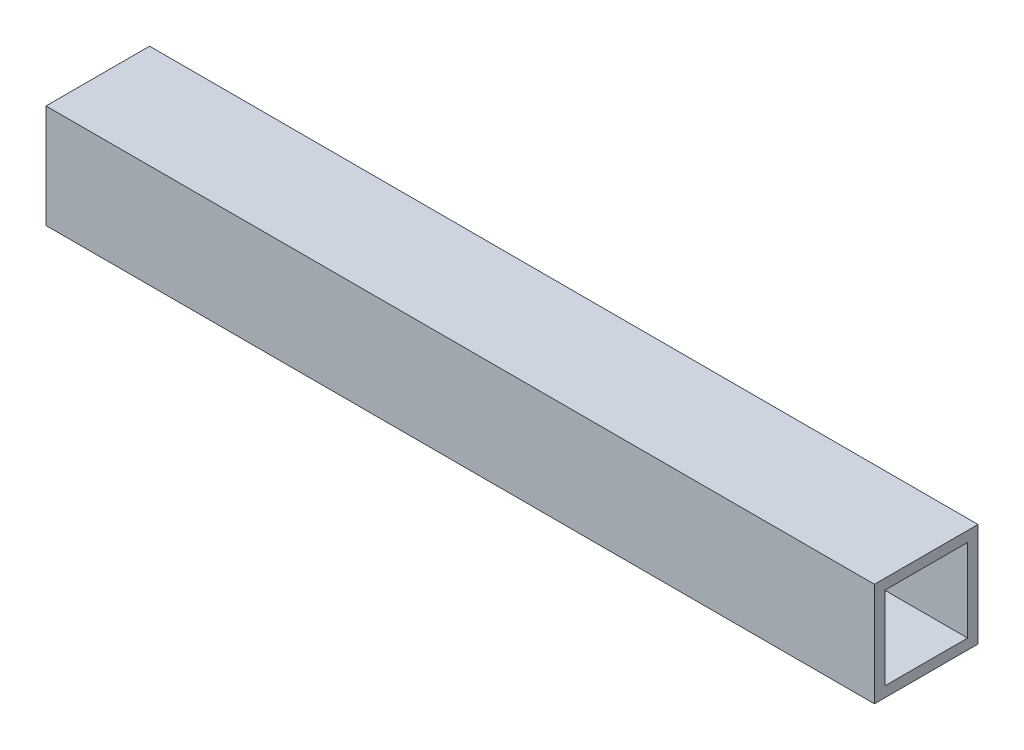
ISO-10303-21;
HEADER;
FILE_DESCRIPTION(('STEP AP214'),'2;1');
FILE_NAME('part.step','',(''),(''),'','','');
FILE_SCHEMA(('AUTOMOTIVE_DESIGN { 1 0 10303 214 1 1 1 1 }'));
ENDSEC;
DATA;
#1=APPLICATION_CONTEXT('core data for automotive mechanical design processes');
#2=APPLICATION_PROTOCOL_DEFINITION('international standard','automotive_design',2000,#1);
#3=PRODUCT_CONTEXT('',#1,'mechanical');
#4=PRODUCT('Part','Part','',(#3));
#5=PRODUCT_RELATED_PRODUCT_CATEGORY('part','',(#4));
#6=PRODUCT_DEFINITION_FORMATION('','',#4);
#7=PRODUCT_DEFINITION_CONTEXT('part definition',#1,'design');
#8=PRODUCT_DEFINITION('design','',#6,#7);
#9=PRODUCT_DEFINITION_SHAPE('','',#8);
#10=(LENGTH_UNIT() NAMED_UNIT(*) SI_UNIT(.MILLI.,.METRE.));
#11=(NAMED_UNIT(*) PLANE_ANGLE_UNIT() SI_UNIT($,.RADIAN.));
#12=(NAMED_UNIT(*) SI_UNIT($,.STERADIAN.) SOLID_ANGLE_UNIT());
#13=UNCERTAINTY_MEASURE_WITH_UNIT(LENGTH_MEASURE(1.E-05),#10,'distance_accuracy_value','');
#14=(GEOMETRIC_REPRESENTATION_CONTEXT(3) GLOBAL_UNCERTAINTY_ASSIGNED_CONTEXT((#13)) GLOBAL_UNIT_ASSIGNED_CONTEXT((#10,
#11,#12)) REPRESENTATION_CONTEXT('',''));
#15=CARTESIAN_POINT('',(0.,0.,0.));
#16=DIRECTION('',(0.,0.,1.));
#17=DIRECTION('',(1.,0.,0.));
#18=AXIS2_PLACEMENT_3D('',#15,#16,#17);
#19=CARTESIAN_POINT('',(203.2,0.,0.));
#20=DIRECTION('',(-1.,0.,0.));
#21=DIRECTION('',(0.,0.,1.));
#22=AXIS2_PLACEMENT_3D('',#19,#20,#21);
#23=PLANE('',#22);
#24=DIRECTION('',(0.,1.,0.));
#25=VECTOR('',#24,1.);
#26=CARTESIAN_POINT('',(203.2,-12.7,-12.7));
#27=LINE('',#26,#25);
#28=CARTESIAN_POINT('',(203.2,-12.7,-12.7));
#29=VERTEX_POINT('',#28);
#30=CARTESIAN_POINT('',(203.2,12.7,-12.7));
#31=VERTEX_POINT('',#30);
#32=EDGE_CURVE('E133',#29,#31,#27,.T.);
#33=ORIENTED_EDGE('',*,*,#32,.T.);
#34=DIRECTION('',(0.,0.,1.));
#35=VECTOR('',#34,1.);
#36=CARTESIAN_POINT('',(203.2,12.7,12.7));
#37=LINE('',#36,#35);
#38=CARTESIAN_POINT('',(203.2,12.7,12.7));
#39=VERTEX_POINT('',#38);
#40=EDGE_CURVE('E136',#31,#39,#37,.T.);
#41=ORIENTED_EDGE('',*,*,#40,.T.);
#42=DIRECTION('',(0.,-1.,0.));
#43=VECTOR('',#42,1.);
#44=CARTESIAN_POINT('',(203.2,-12.7,12.7));
#45=LINE('',#44,#43);
#46=CARTESIAN_POINT('',(203.2,-12.7,12.7));
#47=VERTEX_POINT('',#46);
#48=EDGE_CURVE('E139',#39,#47,#45,.T.);
#49=ORIENTED_EDGE('',*,*,#48,.T.);
#50=DIRECTION('',(0.,0.,-1.));
#51=VECTOR('',#50,1.);
#52=CARTESIAN_POINT('',(203.2,-12.7,12.7));
#53=LINE('',#52,#51);
#54=EDGE_CURVE('E141',#47,#29,#53,.T.);
#55=ORIENTED_EDGE('',*,*,#54,.T.);
#56=EDGE_LOOP('',(#33,#41,#49,#55));
#57=FACE_BOUND('',#56,.T.);
#58=DIRECTION('',(0.,-1.,0.));
#59=VECTOR('',#58,1.);
#60=CARTESIAN_POINT('',(203.2,-10.16,10.16));
#61=LINE('',#60,#59);
#62=CARTESIAN_POINT('',(203.2,10.16,10.16));
#63=VERTEX_POINT('',#62);
#64=CARTESIAN_POINT('',(203.2,-10.16,10.16));
#65=VERTEX_POINT('',#64);
#66=EDGE_CURVE('E97',#63,#65,#61,.T.);
#67=ORIENTED_EDGE('',*,*,#66,.F.);
#68=DIRECTION('',(0.,0.,1.));
#69=VECTOR('',#68,1.);
#70=CARTESIAN_POINT('',(203.2,10.16,10.16));
#71=LINE('',#70,#69);
#72=CARTESIAN_POINT('',(203.2,10.16,-10.16));
#73=VERTEX_POINT('',#72);
#74=EDGE_CURVE('E119',#73,#63,#71,.T.);
#75=ORIENTED_EDGE('',*,*,#74,.F.);
#76=DIRECTION('',(0.,1.,0.));
#77=VECTOR('',#76,1.);
#78=CARTESIAN_POINT('',(203.2,-10.16,-10.16));
#79=LINE('',#78,#77);
#80=CARTESIAN_POINT('',(203.2,-10.16,-10.16));
#81=VERTEX_POINT('',#80);
#82=EDGE_CURVE('E117',#81,#73,#79,.T.);
#83=ORIENTED_EDGE('',*,*,#82,.F.);
#84=DIRECTION('',(0.,0.,-1.));
#85=VECTOR('',#84,1.);
#86=CARTESIAN_POINT('',(203.2,-10.16,10.16));
#87=LINE('',#86,#85);
#88=EDGE_CURVE('E105',#65,#81,#87,.T.);
#89=ORIENTED_EDGE('',*,*,#88,.F.);
#90=EDGE_LOOP('',(#67,#75,#83,#89));
#91=FACE_BOUND('',#90,.T.);
#92=ADVANCED_FACE('F32',(#57,#91),#23,.F.);
#93=CARTESIAN_POINT('',(0.,0.,0.));
#94=DIRECTION('',(-1.,0.,0.));
#95=DIRECTION('',(0.,0.,1.));
#96=AXIS2_PLACEMENT_3D('',#93,#94,#95);
#97=PLANE('',#96);
#98=DIRECTION('',(0.,1.,0.));
#99=VECTOR('',#98,1.);
#100=CARTESIAN_POINT('',(0.,-12.7,-12.7));
#101=LINE('',#100,#99);
#102=CARTESIAN_POINT('',(0.,-12.7,-12.7));
#103=VERTEX_POINT('',#102);
#104=CARTESIAN_POINT('',(0.,12.7,-12.7));
#105=VERTEX_POINT('',#104);
#106=EDGE_CURVE('E113',#103,#105,#101,.T.);
#107=ORIENTED_EDGE('',*,*,#106,.F.);
#108=DIRECTION('',(0.,0.,-1.));
#109=VECTOR('',#108,1.);
#110=CARTESIAN_POINT('',(0.,-12.7,12.7));
#111=LINE('',#110,#109);
#112=CARTESIAN_POINT('',(0.,-12.7,12.7));
#113=VERTEX_POINT('',#112);
#114=EDGE_CURVE('E137',#113,#103,#111,.T.);
#115=ORIENTED_EDGE('',*,*,#114,.F.);
#116=DIRECTION('',(0.,-1.,0.));
#117=VECTOR('',#116,1.);
#118=CARTESIAN_POINT('',(0.,-12.7,12.7));
#119=LINE('',#118,#117);
#120=CARTESIAN_POINT('',(0.,12.7,12.7));
#121=VERTEX_POINT('',#120);
#122=EDGE_CURVE('E148',#121,#113,#119,.T.);
#123=ORIENTED_EDGE('',*,*,#122,.F.);
#124=DIRECTION('',(0.,0.,1.));
#125=VECTOR('',#124,1.);
#126=CARTESIAN_POINT('',(0.,12.7,12.7));
#127=LINE('',#126,#125);
#128=EDGE_CURVE('E146',#105,#121,#127,.T.);
#129=ORIENTED_EDGE('',*,*,#128,.F.);
#130=EDGE_LOOP('',(#107,#115,#123,#129));
#131=FACE_BOUND('',#130,.T.);
#132=DIRECTION('',(0.,0.,1.));
#133=VECTOR('',#132,1.);
#134=CARTESIAN_POINT('',(0.,10.16,10.16));
#135=LINE('',#134,#133);
#136=CARTESIAN_POINT('',(0.,10.16,-10.16));
#137=VERTEX_POINT('',#136);
#138=CARTESIAN_POINT('',(0.,10.16,10.16));
#139=VERTEX_POINT('',#138);
#140=EDGE_CURVE('E106',#137,#139,#135,.T.);
#141=ORIENTED_EDGE('',*,*,#140,.T.);
#142=DIRECTION('',(0.,-1.,0.));
#143=VECTOR('',#142,1.);
#144=CARTESIAN_POINT('',(0.,-10.16,10.16));
#145=LINE('',#144,#143);
#146=CARTESIAN_POINT('',(0.,-10.16,10.16));
#147=VERTEX_POINT('',#146);
#148=EDGE_CURVE('E55',#139,#147,#145,.T.);
#149=ORIENTED_EDGE('',*,*,#148,.T.);
#150=DIRECTION('',(0.,0.,-1.));
#151=VECTOR('',#150,1.);
#152=CARTESIAN_POINT('',(0.,-10.16,10.16));
#153=LINE('',#152,#151);
#154=CARTESIAN_POINT('',(0.,-10.16,-10.16));
#155=VERTEX_POINT('',#154);
#156=EDGE_CURVE('E112',#147,#155,#153,.T.);
#157=ORIENTED_EDGE('',*,*,#156,.T.);
#158=DIRECTION('',(0.,1.,0.));
#159=VECTOR('',#158,1.);
#160=CARTESIAN_POINT('',(0.,-10.16,-10.16));
#161=LINE('',#160,#159);
#162=EDGE_CURVE('E125',#155,#137,#161,.T.);
#163=ORIENTED_EDGE('',*,*,#162,.T.);
#164=EDGE_LOOP('',(#141,#149,#157,#163));
#165=FACE_BOUND('',#164,.T.);
#166=ADVANCED_FACE('F166',(#131,#165),#97,.T.);
#167=CARTESIAN_POINT('',(203.2,-12.7,-12.7));
#168=DIRECTION('',(0.,0.,1.));
#169=DIRECTION('',(1.,0.,0.));
#170=AXIS2_PLACEMENT_3D('',#167,#168,#169);
#171=PLANE('',#170);
#172=ORIENTED_EDGE('',*,*,#106,.T.);
#173=DIRECTION('',(-1.,0.,0.));
#174=VECTOR('',#173,1.);
#175=CARTESIAN_POINT('',(203.2,12.7,-12.7));
#176=LINE('',#175,#174);
#177=EDGE_CURVE('E11',#31,#105,#176,.T.);
#178=ORIENTED_EDGE('',*,*,#177,.F.);
#179=ORIENTED_EDGE('',*,*,#32,.F.);
#180=DIRECTION('',(-1.,0.,0.));
#181=VECTOR('',#180,1.);
#182=CARTESIAN_POINT('',(203.2,-12.7,-12.7));
#183=LINE('',#182,#181);
#184=EDGE_CURVE('E143',#29,#103,#183,.T.);
#185=ORIENTED_EDGE('',*,*,#184,.T.);
#186=EDGE_LOOP('',(#172,#178,#179,#185));
#187=FACE_BOUND('',#186,.T.);
#188=ADVANCED_FACE('F34',(#187),#171,.F.);
#189=CARTESIAN_POINT('',(203.2,12.7,12.7));
#190=DIRECTION('',(0.,-1.,0.));
#191=DIRECTION('',(0.,0.,-1.));
#192=AXIS2_PLACEMENT_3D('',#189,#190,#191);
#193=PLANE('',#192);
#194=ORIENTED_EDGE('',*,*,#128,.T.);
#195=DIRECTION('',(-1.,0.,0.));
#196=VECTOR('',#195,1.);
#197=CARTESIAN_POINT('',(203.2,12.7,12.7));
#198=LINE('',#197,#196);
#199=EDGE_CURVE('E40',#39,#121,#198,.T.);
#200=ORIENTED_EDGE('',*,*,#199,.F.);
#201=ORIENTED_EDGE('',*,*,#40,.F.);
#202=ORIENTED_EDGE('',*,*,#177,.T.);
#203=EDGE_LOOP('',(#194,#200,#201,#202));
#204=FACE_BOUND('',#203,.T.);
#205=ADVANCED_FACE('F176',(#204),#193,.F.);
#206=CARTESIAN_POINT('',(203.2,-12.7,12.7));
#207=DIRECTION('',(0.,0.,-1.));
#208=DIRECTION('',(-1.,0.,0.));
#209=AXIS2_PLACEMENT_3D('',#206,#207,#208);
#210=PLANE('',#209);
#211=ORIENTED_EDGE('',*,*,#122,.T.);
#212=DIRECTION('',(-1.,0.,0.));
#213=VECTOR('',#212,1.);
#214=CARTESIAN_POINT('',(203.2,-12.7,12.7));
#215=LINE('',#214,#213);
#216=EDGE_CURVE('E153',#47,#113,#215,.T.);
#217=ORIENTED_EDGE('',*,*,#216,.F.);
#218=ORIENTED_EDGE('',*,*,#48,.F.);
#219=ORIENTED_EDGE('',*,*,#199,.T.);
#220=EDGE_LOOP('',(#211,#217,#218,#219));
#221=FACE_BOUND('',#220,.T.);
#222=ADVANCED_FACE('F160',(#221),#210,.F.);
#223=CARTESIAN_POINT('',(203.2,-12.7,12.7));
#224=DIRECTION('',(0.,1.,0.));
#225=DIRECTION('',(0.,0.,1.));
#226=AXIS2_PLACEMENT_3D('',#223,#224,#225);
#227=PLANE('',#226);
#228=ORIENTED_EDGE('',*,*,#114,.T.);
#229=ORIENTED_EDGE('',*,*,#184,.F.);
#230=ORIENTED_EDGE('',*,*,#54,.F.);
#231=ORIENTED_EDGE('',*,*,#216,.T.);
#232=EDGE_LOOP('',(#228,#229,#230,#231));
#233=FACE_BOUND('',#232,.T.);
#234=ADVANCED_FACE('F170',(#233),#227,.F.);
#235=CARTESIAN_POINT('',(203.2,-10.16,10.16));
#236=DIRECTION('',(0.,0.,-1.));
#237=DIRECTION('',(-1.,0.,0.));
#238=AXIS2_PLACEMENT_3D('',#235,#236,#237);
#239=PLANE('',#238);
#240=ORIENTED_EDGE('',*,*,#148,.F.);
#241=DIRECTION('',(-1.,0.,0.));
#242=VECTOR('',#241,1.);
#243=CARTESIAN_POINT('',(203.2,10.16,10.16));
#244=LINE('',#243,#242);
#245=EDGE_CURVE('E101',#63,#139,#244,.T.);
#246=ORIENTED_EDGE('',*,*,#245,.F.);
#247=ORIENTED_EDGE('',*,*,#66,.T.);
#248=DIRECTION('',(-1.,0.,0.));
#249=VECTOR('',#248,1.);
#250=CARTESIAN_POINT('',(203.2,-10.16,10.16));
#251=LINE('',#250,#249);
#252=EDGE_CURVE('E100',#65,#147,#251,.T.);
#253=ORIENTED_EDGE('',*,*,#252,.T.);
#254=EDGE_LOOP('',(#240,#246,#247,#253));
#255=FACE_BOUND('',#254,.T.);
#256=ADVANCED_FACE('F99',(#255),#239,.T.);
#257=CARTESIAN_POINT('',(203.2,-10.16,10.16));
#258=DIRECTION('',(0.,1.,0.));
#259=DIRECTION('',(0.,0.,1.));
#260=AXIS2_PLACEMENT_3D('',#257,#258,#259);
#261=PLANE('',#260);
#262=ORIENTED_EDGE('',*,*,#156,.F.);
#263=ORIENTED_EDGE('',*,*,#252,.F.);
#264=ORIENTED_EDGE('',*,*,#88,.T.);
#265=DIRECTION('',(-1.,0.,0.));
#266=VECTOR('',#265,1.);
#267=CARTESIAN_POINT('',(203.2,-10.16,-10.16));
#268=LINE('',#267,#266);
#269=EDGE_CURVE('E114',#81,#155,#268,.T.);
#270=ORIENTED_EDGE('',*,*,#269,.T.);
#271=EDGE_LOOP('',(#262,#263,#264,#270));
#272=FACE_BOUND('',#271,.T.);
#273=ADVANCED_FACE('F109',(#272),#261,.T.);
#274=CARTESIAN_POINT('',(203.2,-10.16,-10.16));
#275=DIRECTION('',(0.,0.,1.));
#276=DIRECTION('',(1.,0.,0.));
#277=AXIS2_PLACEMENT_3D('',#274,#275,#276);
#278=PLANE('',#277);
#279=ORIENTED_EDGE('',*,*,#162,.F.);
#280=ORIENTED_EDGE('',*,*,#269,.F.);
#281=ORIENTED_EDGE('',*,*,#82,.T.);
#282=DIRECTION('',(-1.,0.,0.));
#283=VECTOR('',#282,1.);
#284=CARTESIAN_POINT('',(203.2,10.16,-10.16));
#285=LINE('',#284,#283);
#286=EDGE_CURVE('E47',#73,#137,#285,.T.);
#287=ORIENTED_EDGE('',*,*,#286,.T.);
#288=EDGE_LOOP('',(#279,#280,#281,#287));
#289=FACE_BOUND('',#288,.T.);
#290=ADVANCED_FACE('F199',(#289),#278,.T.);
#291=CARTESIAN_POINT('',(203.2,10.16,10.16));
#292=DIRECTION('',(0.,-1.,0.));
#293=DIRECTION('',(0.,0.,-1.));
#294=AXIS2_PLACEMENT_3D('',#291,#292,#293);
#295=PLANE('',#294);
#296=ORIENTED_EDGE('',*,*,#140,.F.);
#297=ORIENTED_EDGE('',*,*,#286,.F.);
#298=ORIENTED_EDGE('',*,*,#74,.T.);
#299=ORIENTED_EDGE('',*,*,#245,.T.);
#300=EDGE_LOOP('',(#296,#297,#298,#299));
#301=FACE_BOUND('',#300,.T.);
#302=ADVANCED_FACE('F203',(#301),#295,.T.);
#303=CLOSED_SHELL('',(#92,#166,#188,#205,#222,#234,#256,#273,#290,#302));
#304=MANIFOLD_SOLID_BREP('B2',#303);
#305=ADVANCED_BREP_SHAPE_REPRESENTATION('',(#18,#304),#14);
#306=SHAPE_DEFINITION_REPRESENTATION(#9,#305);
ENDSEC;
END-ISO-10303-21;
